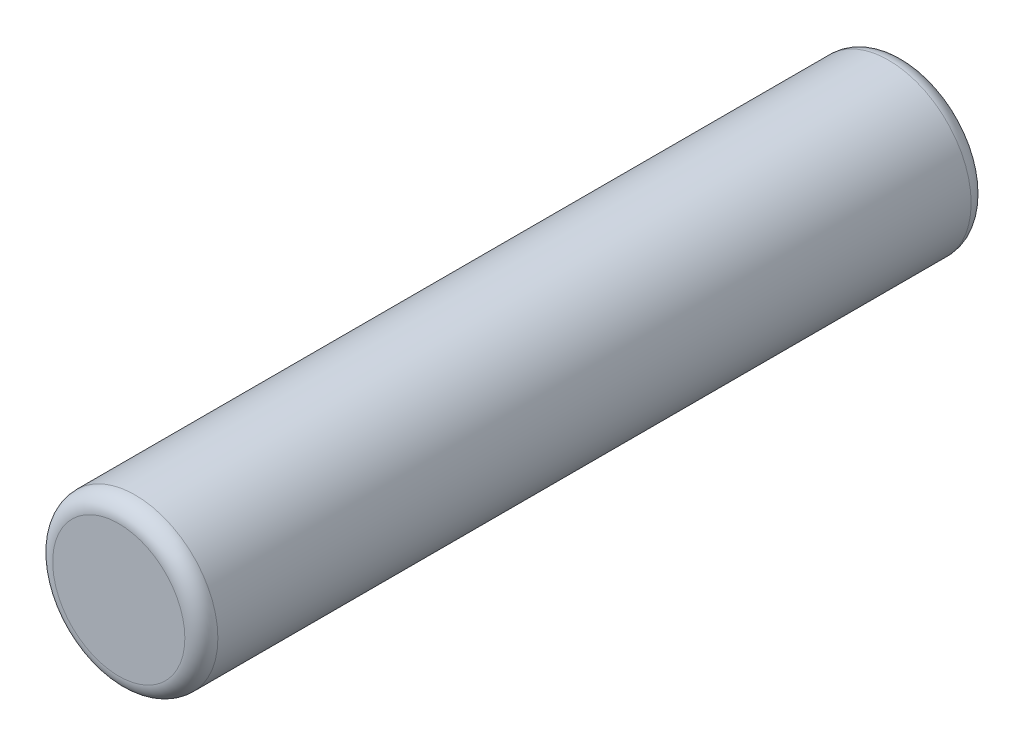
ISO-10303-21;
HEADER;
FILE_DESCRIPTION(('STEP AP214'),'2;1');
FILE_NAME('part.step','',(''),(''),'','','');
FILE_SCHEMA(('AUTOMOTIVE_DESIGN { 1 0 10303 214 1 1 1 1 }'));
ENDSEC;
DATA;
#1=APPLICATION_CONTEXT('core data for automotive mechanical design processes');
#2=APPLICATION_PROTOCOL_DEFINITION('international standard','automotive_design',2000,#1);
#3=PRODUCT_CONTEXT('',#1,'mechanical');
#4=PRODUCT('Part','Part','',(#3));
#5=PRODUCT_RELATED_PRODUCT_CATEGORY('part','',(#4));
#6=PRODUCT_DEFINITION_FORMATION('','',#4);
#7=PRODUCT_DEFINITION_CONTEXT('part definition',#1,'design');
#8=PRODUCT_DEFINITION('design','',#6,#7);
#9=PRODUCT_DEFINITION_SHAPE('','',#8);
#10=(LENGTH_UNIT() NAMED_UNIT(*) SI_UNIT(.MILLI.,.METRE.));
#11=(NAMED_UNIT(*) PLANE_ANGLE_UNIT() SI_UNIT($,.RADIAN.));
#12=(NAMED_UNIT(*) SI_UNIT($,.STERADIAN.) SOLID_ANGLE_UNIT());
#13=UNCERTAINTY_MEASURE_WITH_UNIT(LENGTH_MEASURE(1.E-05),#10,'distance_accuracy_value','');
#14=(GEOMETRIC_REPRESENTATION_CONTEXT(3) GLOBAL_UNCERTAINTY_ASSIGNED_CONTEXT((#13)) GLOBAL_UNIT_ASSIGNED_CONTEXT((#10,
#11,#12)) REPRESENTATION_CONTEXT('',''));
#15=CARTESIAN_POINT('',(0.,0.,0.));
#16=DIRECTION('',(0.,0.,1.));
#17=DIRECTION('',(1.,0.,0.));
#18=AXIS2_PLACEMENT_3D('',#15,#16,#17);
#19=CARTESIAN_POINT('',(0.,0.,23.8));
#20=DIRECTION('',(0.,0.,-1.));
#21=DIRECTION('',(-1.,0.,0.));
#22=AXIS2_PLACEMENT_3D('',#19,#20,#21);
#23=CYLINDRICAL_SURFACE('',#22,2.5);
#24=CARTESIAN_POINT('',(0.,0.,23.3));
#25=DIRECTION('',(0.,0.,1.));
#26=DIRECTION('',(1.,0.,0.));
#27=AXIS2_PLACEMENT_3D('',#24,#25,#26);
#28=CIRCLE('',#27,2.5);
#29=CARTESIAN_POINT('',(2.49999999999998,0.,23.3));
#30=VERTEX_POINT('',#29);
#31=EDGE_CURVE('E36',#30,#30,#28,.F.);
#32=ORIENTED_EDGE('',*,*,#31,.T.);
#33=EDGE_LOOP('',(#32));
#34=FACE_BOUND('',#33,.T.);
#35=CARTESIAN_POINT('',(0.,0.,0.5));
#36=DIRECTION('',(0.,0.,1.));
#37=DIRECTION('',(1.,0.,0.));
#38=AXIS2_PLACEMENT_3D('',#35,#36,#37);
#39=CIRCLE('',#38,2.5);
#40=CARTESIAN_POINT('',(2.49999999999998,0.,0.5));
#41=VERTEX_POINT('',#40);
#42=EDGE_CURVE('E40',#41,#41,#39,.T.);
#43=ORIENTED_EDGE('',*,*,#42,.T.);
#44=EDGE_LOOP('',(#43));
#45=FACE_BOUND('',#44,.T.);
#46=ADVANCED_FACE('F30',(#34,#45),#23,.T.);
#47=CARTESIAN_POINT('',(0.,0.,23.8));
#48=DIRECTION('',(0.,0.,1.));
#49=DIRECTION('',(1.,0.,0.));
#50=AXIS2_PLACEMENT_3D('',#47,#48,#49);
#51=PLANE('',#50);
#52=CARTESIAN_POINT('',(0.,0.,23.8));
#53=DIRECTION('',(0.,0.,1.));
#54=DIRECTION('',(1.,0.,0.));
#55=AXIS2_PLACEMENT_3D('',#52,#53,#54);
#56=CIRCLE('',#55,2.);
#57=CARTESIAN_POINT('',(1.99999999999998,0.,23.8));
#58=VERTEX_POINT('',#57);
#59=EDGE_CURVE('E44',#58,#58,#56,.T.);
#60=ORIENTED_EDGE('',*,*,#59,.T.);
#61=EDGE_LOOP('',(#60));
#62=FACE_BOUND('',#61,.T.);
#63=ADVANCED_FACE('F50',(#62),#51,.T.);
#64=CARTESIAN_POINT('',(0.,0.,0.));
#65=DIRECTION('',(0.,0.,1.));
#66=DIRECTION('',(1.,0.,0.));
#67=AXIS2_PLACEMENT_3D('',#64,#65,#66);
#68=PLANE('',#67);
#69=CARTESIAN_POINT('',(0.,0.,0.));
#70=DIRECTION('',(0.,0.,1.));
#71=DIRECTION('',(1.,0.,0.));
#72=AXIS2_PLACEMENT_3D('',#69,#70,#71);
#73=CIRCLE('',#72,2.);
#74=CARTESIAN_POINT('',(1.99999999999998,0.,0.));
#75=VERTEX_POINT('',#74);
#76=EDGE_CURVE('E10',#75,#75,#73,.F.);
#77=ORIENTED_EDGE('',*,*,#76,.T.);
#78=EDGE_LOOP('',(#77));
#79=FACE_BOUND('',#78,.T.);
#80=ADVANCED_FACE('F55',(#79),#68,.F.);
#81=CARTESIAN_POINT('',(0.,0.,23.3));
#82=DIRECTION('',(0.,0.,1.));
#83=DIRECTION('',(1.,0.,0.));
#84=AXIS2_PLACEMENT_3D('',#81,#82,#83);
#85=TOROIDAL_SURFACE('',#84,2.,0.5);
#86=ORIENTED_EDGE('',*,*,#31,.F.);
#87=EDGE_LOOP('',(#86));
#88=FACE_BOUND('',#87,.T.);
#89=ORIENTED_EDGE('',*,*,#59,.F.);
#90=EDGE_LOOP('',(#89));
#91=FACE_BOUND('',#90,.T.);
#92=ADVANCED_FACE('F52',(#88,#91),#85,.T.);
#93=CARTESIAN_POINT('',(0.,0.,0.5));
#94=DIRECTION('',(0.,0.,1.));
#95=DIRECTION('',(1.,0.,0.));
#96=AXIS2_PLACEMENT_3D('',#93,#94,#95);
#97=TOROIDAL_SURFACE('',#96,2.,0.5);
#98=ORIENTED_EDGE('',*,*,#76,.F.);
#99=EDGE_LOOP('',(#98));
#100=FACE_BOUND('',#99,.T.);
#101=ORIENTED_EDGE('',*,*,#42,.F.);
#102=EDGE_LOOP('',(#101));
#103=FACE_BOUND('',#102,.T.);
#104=ADVANCED_FACE('F54',(#100,#103),#97,.T.);
#105=CLOSED_SHELL('',(#46,#63,#80,#92,#104));
#106=MANIFOLD_SOLID_BREP('B2',#105);
#107=ADVANCED_BREP_SHAPE_REPRESENTATION('',(#18,#106),#14);
#108=SHAPE_DEFINITION_REPRESENTATION(#9,#107);
ENDSEC;
END-ISO-10303-21;
